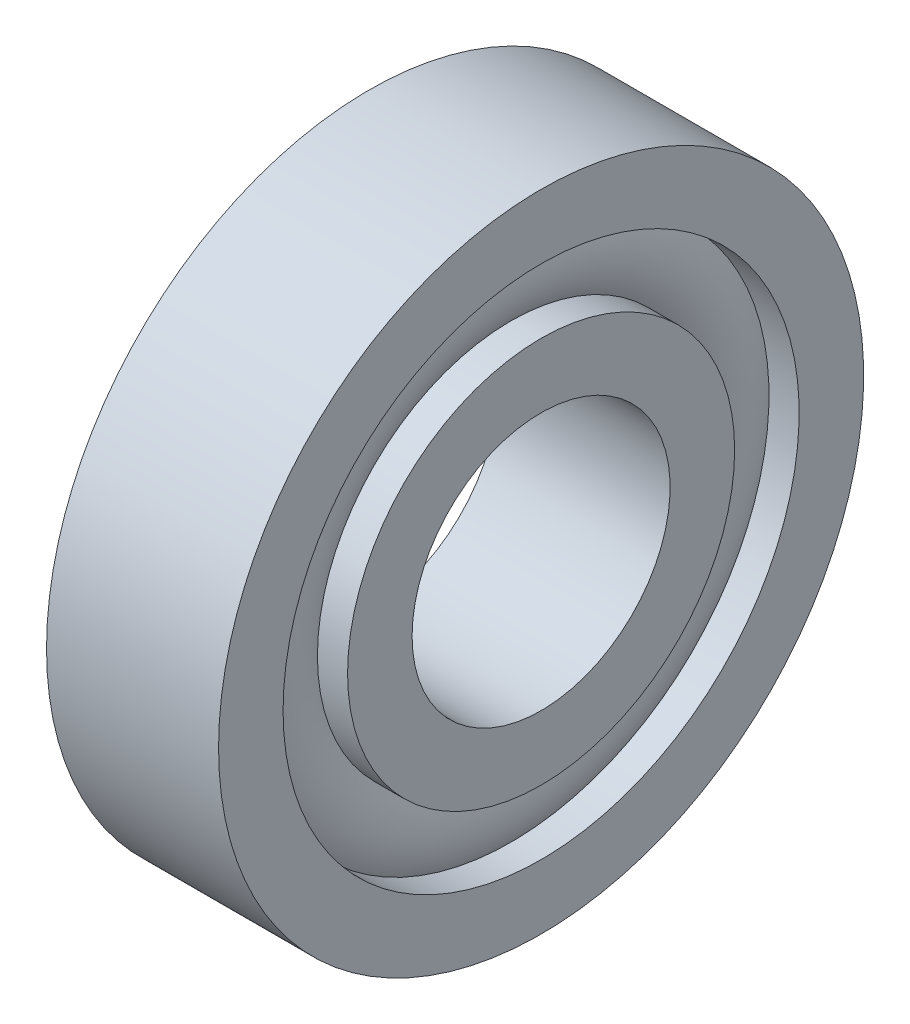
ISO-10303-21;
HEADER;
FILE_DESCRIPTION(('STEP AP214'),'2;1');
FILE_NAME('part.step','',(''),(''),'','','');
FILE_SCHEMA(('AUTOMOTIVE_DESIGN { 1 0 10303 214 1 1 1 1 }'));
ENDSEC;
DATA;
#1=APPLICATION_CONTEXT('core data for automotive mechanical design processes');
#2=APPLICATION_PROTOCOL_DEFINITION('international standard','automotive_design',2000,#1);
#3=PRODUCT_CONTEXT('',#1,'mechanical');
#4=PRODUCT('Part','Part','',(#3));
#5=PRODUCT_RELATED_PRODUCT_CATEGORY('part','',(#4));
#6=PRODUCT_DEFINITION_FORMATION('','',#4);
#7=PRODUCT_DEFINITION_CONTEXT('part definition',#1,'design');
#8=PRODUCT_DEFINITION('design','',#6,#7);
#9=PRODUCT_DEFINITION_SHAPE('','',#8);
#10=(LENGTH_UNIT() NAMED_UNIT(*) SI_UNIT(.MILLI.,.METRE.));
#11=(NAMED_UNIT(*) PLANE_ANGLE_UNIT() SI_UNIT($,.RADIAN.));
#12=(NAMED_UNIT(*) SI_UNIT($,.STERADIAN.) SOLID_ANGLE_UNIT());
#13=UNCERTAINTY_MEASURE_WITH_UNIT(LENGTH_MEASURE(1.E-05),#10,'distance_accuracy_value','');
#14=(GEOMETRIC_REPRESENTATION_CONTEXT(3) GLOBAL_UNCERTAINTY_ASSIGNED_CONTEXT((#13)) GLOBAL_UNIT_ASSIGNED_CONTEXT((#10,
#11,#12)) REPRESENTATION_CONTEXT('',''));
#15=CARTESIAN_POINT('',(0.,0.,0.));
#16=DIRECTION('',(0.,0.,1.));
#17=DIRECTION('',(1.,0.,0.));
#18=AXIS2_PLACEMENT_3D('',#15,#16,#17);
#19=CARTESIAN_POINT('',(-4.,6.,0.));
#20=DIRECTION('',(1.,0.,0.));
#21=DIRECTION('',(0.,0.,-1.));
#22=AXIS2_PLACEMENT_3D('',#19,#20,#21);
#23=PLANE('',#22);
#24=CARTESIAN_POINT('',(-4.,0.,0.));
#25=DIRECTION('',(-1.,0.,0.));
#26=DIRECTION('',(0.,0.,1.));
#27=AXIS2_PLACEMENT_3D('',#24,#25,#26);
#28=CIRCLE('',#27,6.);
#29=CARTESIAN_POINT('',(-4.,0.,6.));
#30=VERTEX_POINT('',#29);
#31=EDGE_CURVE('E71',#30,#30,#28,.T.);
#32=ORIENTED_EDGE('',*,*,#31,.F.);
#33=EDGE_LOOP('',(#32));
#34=FACE_BOUND('',#33,.T.);
#35=CARTESIAN_POINT('',(-4.,0.,0.));
#36=DIRECTION('',(-1.,0.,0.));
#37=DIRECTION('',(0.,0.,1.));
#38=AXIS2_PLACEMENT_3D('',#35,#36,#37);
#39=CIRCLE('',#38,8.99999999999999);
#40=CARTESIAN_POINT('',(-4.,0.,8.99999999999999));
#41=VERTEX_POINT('',#40);
#42=EDGE_CURVE('E10',#41,#41,#39,.T.);
#43=ORIENTED_EDGE('',*,*,#42,.T.);
#44=EDGE_LOOP('',(#43));
#45=FACE_BOUND('',#44,.T.);
#46=ADVANCED_FACE('F31',(#34,#45),#23,.F.);
#47=CARTESIAN_POINT('',(-4.,0.,0.));
#48=DIRECTION('',(-1.,0.,0.));
#49=DIRECTION('',(0.,0.,1.));
#50=AXIS2_PLACEMENT_3D('',#47,#48,#49);
#51=CYLINDRICAL_SURFACE('',#50,8.99999999999999);
#52=ORIENTED_EDGE('',*,*,#42,.F.);
#53=EDGE_LOOP('',(#52));
#54=FACE_BOUND('',#53,.T.);
#55=CARTESIAN_POINT('',(-2.59807621135331,0.,0.));
#56=DIRECTION('',(-1.,0.,0.));
#57=DIRECTION('',(0.,0.,1.));
#58=AXIS2_PLACEMENT_3D('',#55,#56,#57);
#59=CIRCLE('',#58,8.99999999999999);
#60=CARTESIAN_POINT('',(-2.59807621135331,0.,8.99999999999999));
#61=VERTEX_POINT('',#60);
#62=EDGE_CURVE('E37',#61,#61,#59,.T.);
#63=ORIENTED_EDGE('',*,*,#62,.T.);
#64=EDGE_LOOP('',(#63));
#65=FACE_BOUND('',#64,.T.);
#66=ADVANCED_FACE('F78',(#54,#65),#51,.T.);
#67=CARTESIAN_POINT('',(0.,0.,0.));
#68=DIRECTION('',(-1.,0.,0.));
#69=DIRECTION('',(0.,0.,1.));
#70=AXIS2_PLACEMENT_3D('',#67,#68,#69);
#71=TOROIDAL_SURFACE('',#70,10.5,3.);
#72=ORIENTED_EDGE('',*,*,#62,.F.);
#73=EDGE_LOOP('',(#72));
#74=FACE_BOUND('',#73,.T.);
#75=CARTESIAN_POINT('',(-2.59807621135331,0.,0.));
#76=DIRECTION('',(-1.,0.,0.));
#77=DIRECTION('',(0.,0.,1.));
#78=AXIS2_PLACEMENT_3D('',#75,#76,#77);
#79=CIRCLE('',#78,12.);
#80=CARTESIAN_POINT('',(-2.59807621135331,0.,12.));
#81=VERTEX_POINT('',#80);
#82=EDGE_CURVE('E41',#81,#81,#79,.T.);
#83=ORIENTED_EDGE('',*,*,#82,.T.);
#84=EDGE_LOOP('',(#83));
#85=FACE_BOUND('',#84,.T.);
#86=ADVANCED_FACE('F82',(#74,#85),#71,.T.);
#87=CARTESIAN_POINT('',(-4.,0.,0.));
#88=DIRECTION('',(-1.,0.,0.));
#89=DIRECTION('',(0.,0.,1.));
#90=AXIS2_PLACEMENT_3D('',#87,#88,#89);
#91=CYLINDRICAL_SURFACE('',#90,12.);
#92=ORIENTED_EDGE('',*,*,#82,.F.);
#93=EDGE_LOOP('',(#92));
#94=FACE_BOUND('',#93,.T.);
#95=CARTESIAN_POINT('',(-4.,0.,0.));
#96=DIRECTION('',(-1.,0.,0.));
#97=DIRECTION('',(0.,0.,1.));
#98=AXIS2_PLACEMENT_3D('',#95,#96,#97);
#99=CIRCLE('',#98,12.);
#100=CARTESIAN_POINT('',(-4.,0.,12.));
#101=VERTEX_POINT('',#100);
#102=EDGE_CURVE('E45',#101,#101,#99,.T.);
#103=ORIENTED_EDGE('',*,*,#102,.T.);
#104=EDGE_LOOP('',(#103));
#105=FACE_BOUND('',#104,.T.);
#106=ADVANCED_FACE('F87',(#94,#105),#91,.F.);
#107=CARTESIAN_POINT('',(-4.,15.,0.));
#108=DIRECTION('',(1.,0.,0.));
#109=DIRECTION('',(0.,0.,-1.));
#110=AXIS2_PLACEMENT_3D('',#107,#108,#109);
#111=PLANE('',#110);
#112=ORIENTED_EDGE('',*,*,#102,.F.);
#113=EDGE_LOOP('',(#112));
#114=FACE_BOUND('',#113,.T.);
#115=CARTESIAN_POINT('',(-4.,0.,0.));
#116=DIRECTION('',(-1.,0.,0.));
#117=DIRECTION('',(0.,0.,1.));
#118=AXIS2_PLACEMENT_3D('',#115,#116,#117);
#119=CIRCLE('',#118,15.);
#120=CARTESIAN_POINT('',(-4.,0.,15.));
#121=VERTEX_POINT('',#120);
#122=EDGE_CURVE('E50',#121,#121,#119,.T.);
#123=ORIENTED_EDGE('',*,*,#122,.T.);
#124=EDGE_LOOP('',(#123));
#125=FACE_BOUND('',#124,.T.);
#126=ADVANCED_FACE('F93',(#114,#125),#111,.F.);
#127=CARTESIAN_POINT('',(-4.,0.,0.));
#128=DIRECTION('',(-1.,0.,0.));
#129=DIRECTION('',(0.,0.,1.));
#130=AXIS2_PLACEMENT_3D('',#127,#128,#129);
#131=CYLINDRICAL_SURFACE('',#130,15.);
#132=ORIENTED_EDGE('',*,*,#122,.F.);
#133=EDGE_LOOP('',(#132));
#134=FACE_BOUND('',#133,.T.);
#135=CARTESIAN_POINT('',(4.,0.,0.));
#136=DIRECTION('',(-1.,0.,0.));
#137=DIRECTION('',(0.,0.,1.));
#138=AXIS2_PLACEMENT_3D('',#135,#136,#137);
#139=CIRCLE('',#138,15.);
#140=CARTESIAN_POINT('',(4.,0.,15.));
#141=VERTEX_POINT('',#140);
#142=EDGE_CURVE('E53',#141,#141,#139,.T.);
#143=ORIENTED_EDGE('',*,*,#142,.T.);
#144=EDGE_LOOP('',(#143));
#145=FACE_BOUND('',#144,.T.);
#146=ADVANCED_FACE('F97',(#134,#145),#131,.T.);
#147=CARTESIAN_POINT('',(4.,15.,0.));
#148=DIRECTION('',(-1.,0.,0.));
#149=DIRECTION('',(0.,0.,1.));
#150=AXIS2_PLACEMENT_3D('',#147,#148,#149);
#151=PLANE('',#150);
#152=ORIENTED_EDGE('',*,*,#142,.F.);
#153=EDGE_LOOP('',(#152));
#154=FACE_BOUND('',#153,.T.);
#155=CARTESIAN_POINT('',(4.,0.,0.));
#156=DIRECTION('',(-1.,0.,0.));
#157=DIRECTION('',(0.,0.,1.));
#158=AXIS2_PLACEMENT_3D('',#155,#156,#157);
#159=CIRCLE('',#158,12.);
#160=CARTESIAN_POINT('',(4.,0.,12.));
#161=VERTEX_POINT('',#160);
#162=EDGE_CURVE('E56',#161,#161,#159,.T.);
#163=ORIENTED_EDGE('',*,*,#162,.T.);
#164=EDGE_LOOP('',(#163));
#165=FACE_BOUND('',#164,.T.);
#166=ADVANCED_FACE('F101',(#154,#165),#151,.F.);
#167=CARTESIAN_POINT('',(-4.,0.,0.));
#168=DIRECTION('',(-1.,0.,0.));
#169=DIRECTION('',(0.,0.,1.));
#170=AXIS2_PLACEMENT_3D('',#167,#168,#169);
#171=CYLINDRICAL_SURFACE('',#170,12.);
#172=ORIENTED_EDGE('',*,*,#162,.F.);
#173=EDGE_LOOP('',(#172));
#174=FACE_BOUND('',#173,.T.);
#175=CARTESIAN_POINT('',(2.59807621135331,0.,0.));
#176=DIRECTION('',(-1.,0.,0.));
#177=DIRECTION('',(0.,0.,1.));
#178=AXIS2_PLACEMENT_3D('',#175,#176,#177);
#179=CIRCLE('',#178,12.);
#180=CARTESIAN_POINT('',(2.59807621135331,0.,12.));
#181=VERTEX_POINT('',#180);
#182=EDGE_CURVE('E59',#181,#181,#179,.T.);
#183=ORIENTED_EDGE('',*,*,#182,.T.);
#184=EDGE_LOOP('',(#183));
#185=FACE_BOUND('',#184,.T.);
#186=ADVANCED_FACE('F105',(#174,#185),#171,.F.);
#187=CARTESIAN_POINT('',(0.,0.,0.));
#188=DIRECTION('',(-1.,0.,0.));
#189=DIRECTION('',(0.,0.,1.));
#190=AXIS2_PLACEMENT_3D('',#187,#188,#189);
#191=TOROIDAL_SURFACE('',#190,10.5,3.);
#192=ORIENTED_EDGE('',*,*,#182,.F.);
#193=EDGE_LOOP('',(#192));
#194=FACE_BOUND('',#193,.T.);
#195=CARTESIAN_POINT('',(2.59807621135331,0.,0.));
#196=DIRECTION('',(-1.,0.,0.));
#197=DIRECTION('',(0.,0.,1.));
#198=AXIS2_PLACEMENT_3D('',#195,#196,#197);
#199=CIRCLE('',#198,8.99999999999999);
#200=CARTESIAN_POINT('',(2.59807621135331,0.,8.99999999999999));
#201=VERTEX_POINT('',#200);
#202=EDGE_CURVE('E62',#201,#201,#199,.T.);
#203=ORIENTED_EDGE('',*,*,#202,.T.);
#204=EDGE_LOOP('',(#203));
#205=FACE_BOUND('',#204,.T.);
#206=ADVANCED_FACE('F109',(#194,#205),#191,.T.);
#207=CARTESIAN_POINT('',(-4.,0.,0.));
#208=DIRECTION('',(-1.,0.,0.));
#209=DIRECTION('',(0.,0.,1.));
#210=AXIS2_PLACEMENT_3D('',#207,#208,#209);
#211=CYLINDRICAL_SURFACE('',#210,8.99999999999999);
#212=ORIENTED_EDGE('',*,*,#202,.F.);
#213=EDGE_LOOP('',(#212));
#214=FACE_BOUND('',#213,.T.);
#215=CARTESIAN_POINT('',(4.,0.,0.));
#216=DIRECTION('',(-1.,0.,0.));
#217=DIRECTION('',(0.,0.,1.));
#218=AXIS2_PLACEMENT_3D('',#215,#216,#217);
#219=CIRCLE('',#218,8.99999999999999);
#220=CARTESIAN_POINT('',(4.,0.,8.99999999999999));
#221=VERTEX_POINT('',#220);
#222=EDGE_CURVE('E65',#221,#221,#219,.T.);
#223=ORIENTED_EDGE('',*,*,#222,.T.);
#224=EDGE_LOOP('',(#223));
#225=FACE_BOUND('',#224,.T.);
#226=ADVANCED_FACE('F113',(#214,#225),#211,.T.);
#227=CARTESIAN_POINT('',(4.,6.,0.));
#228=DIRECTION('',(-1.,0.,0.));
#229=DIRECTION('',(0.,0.,1.));
#230=AXIS2_PLACEMENT_3D('',#227,#228,#229);
#231=PLANE('',#230);
#232=ORIENTED_EDGE('',*,*,#222,.F.);
#233=EDGE_LOOP('',(#232));
#234=FACE_BOUND('',#233,.T.);
#235=CARTESIAN_POINT('',(4.,0.,0.));
#236=DIRECTION('',(-1.,0.,0.));
#237=DIRECTION('',(0.,0.,1.));
#238=AXIS2_PLACEMENT_3D('',#235,#236,#237);
#239=CIRCLE('',#238,6.);
#240=CARTESIAN_POINT('',(4.,0.,6.));
#241=VERTEX_POINT('',#240);
#242=EDGE_CURVE('E68',#241,#241,#239,.T.);
#243=ORIENTED_EDGE('',*,*,#242,.T.);
#244=EDGE_LOOP('',(#243));
#245=FACE_BOUND('',#244,.T.);
#246=ADVANCED_FACE('F117',(#234,#245),#231,.F.);
#247=CARTESIAN_POINT('',(-4.,0.,0.));
#248=DIRECTION('',(-1.,0.,0.));
#249=DIRECTION('',(0.,0.,1.));
#250=AXIS2_PLACEMENT_3D('',#247,#248,#249);
#251=CYLINDRICAL_SURFACE('',#250,6.);
#252=ORIENTED_EDGE('',*,*,#242,.F.);
#253=EDGE_LOOP('',(#252));
#254=FACE_BOUND('',#253,.T.);
#255=ORIENTED_EDGE('',*,*,#31,.T.);
#256=EDGE_LOOP('',(#255));
#257=FACE_BOUND('',#256,.T.);
#258=ADVANCED_FACE('F75',(#254,#257),#251,.F.);
#259=CLOSED_SHELL('',(#46,#66,#86,#106,#126,#146,#166,#186,#206,#226,#246,#258));
#260=MANIFOLD_SOLID_BREP('B2',#259);
#261=ADVANCED_BREP_SHAPE_REPRESENTATION('',(#18,#260),#14);
#262=SHAPE_DEFINITION_REPRESENTATION(#9,#261);
ENDSEC;
END-ISO-10303-21;
